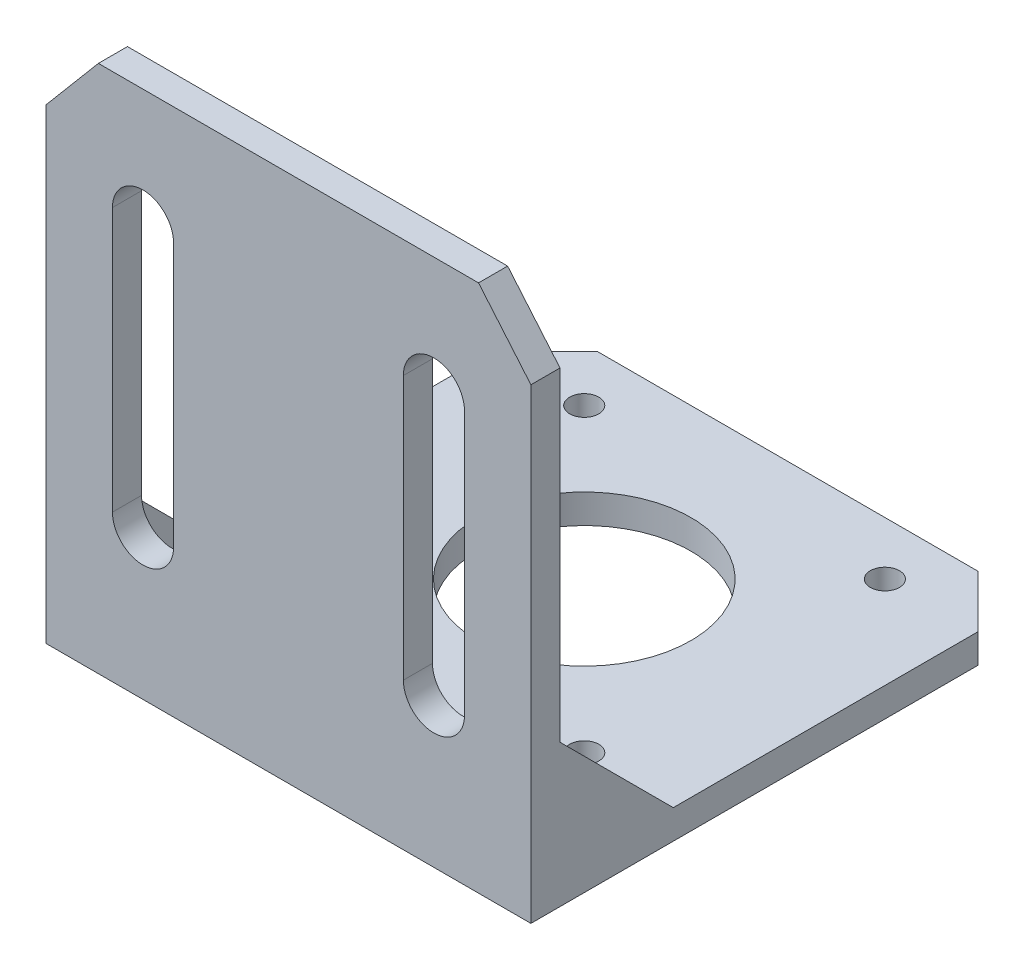
ISO-10303-21;
HEADER;
FILE_DESCRIPTION(('STEP AP214'),'2;1');
FILE_NAME('part.step','',(''),(''),'','','');
FILE_SCHEMA(('AUTOMOTIVE_DESIGN { 1 0 10303 214 1 1 1 1 }'));
ENDSEC;
DATA;
#1=APPLICATION_CONTEXT('core data for automotive mechanical design processes');
#2=APPLICATION_PROTOCOL_DEFINITION('international standard','automotive_design',2000,#1);
#3=PRODUCT_CONTEXT('',#1,'mechanical');
#4=PRODUCT('Part','Part','',(#3));
#5=PRODUCT_RELATED_PRODUCT_CATEGORY('part','',(#4));
#6=PRODUCT_DEFINITION_FORMATION('','',#4);
#7=PRODUCT_DEFINITION_CONTEXT('part definition',#1,'design');
#8=PRODUCT_DEFINITION('design','',#6,#7);
#9=PRODUCT_DEFINITION_SHAPE('','',#8);
#10=(LENGTH_UNIT() NAMED_UNIT(*) SI_UNIT(.MILLI.,.METRE.));
#11=(NAMED_UNIT(*) PLANE_ANGLE_UNIT() SI_UNIT($,.RADIAN.));
#12=(NAMED_UNIT(*) SI_UNIT($,.STERADIAN.) SOLID_ANGLE_UNIT());
#13=UNCERTAINTY_MEASURE_WITH_UNIT(LENGTH_MEASURE(1.E-05),#10,'distance_accuracy_value','');
#14=(GEOMETRIC_REPRESENTATION_CONTEXT(3) GLOBAL_UNCERTAINTY_ASSIGNED_CONTEXT((#13)) GLOBAL_UNIT_ASSIGNED_CONTEXT((#10,
#11,#12)) REPRESENTATION_CONTEXT('',''));
#15=CARTESIAN_POINT('',(0.,0.,0.));
#16=DIRECTION('',(0.,0.,1.));
#17=DIRECTION('',(1.,0.,0.));
#18=AXIS2_PLACEMENT_3D('',#15,#16,#17);
#19=CARTESIAN_POINT('',(0.,3.,0.));
#20=DIRECTION('',(0.,-1.,0.));
#21=DIRECTION('',(0.,0.,-1.));
#22=AXIS2_PLACEMENT_3D('',#19,#20,#21);
#23=PLANE('',#22);
#24=DIRECTION('',(0.,0.,1.));
#25=VECTOR('',#24,1.);
#26=CARTESIAN_POINT('',(22.,3.,0.));
#27=LINE('',#26,#25);
#28=CARTESIAN_POINT('',(22.,3.,8.36981639604411));
#29=VERTEX_POINT('',#28);
#30=CARTESIAN_POINT('',(22.,3.,20.05));
#31=VERTEX_POINT('',#30);
#32=EDGE_CURVE('E61',#29,#31,#27,.T.);
#33=ORIENTED_EDGE('',*,*,#32,.F.);
#34=DIRECTION('',(-1.,0.,0.));
#35=VECTOR('',#34,1.);
#36=CARTESIAN_POINT('',(0.,3.,8.36981639604411));
#37=LINE('',#36,#35);
#38=CARTESIAN_POINT('',(25.,3.,8.36981639604411));
#39=VERTEX_POINT('',#38);
#40=EDGE_CURVE('E205',#29,#39,#37,.F.);
#41=ORIENTED_EDGE('',*,*,#40,.T.);
#42=DIRECTION('',(0.,0.,-1.));
#43=VECTOR('',#42,1.);
#44=CARTESIAN_POINT('',(25.,3.,23.05));
#45=LINE('',#44,#43);
#46=CARTESIAN_POINT('',(25.,3.,-23.05));
#47=VERTEX_POINT('',#46);
#48=EDGE_CURVE('E314',#39,#47,#45,.T.);
#49=ORIENTED_EDGE('',*,*,#48,.T.);
#50=DIRECTION('',(-0.707106781186548,0.,-0.707106781186547));
#51=VECTOR('',#50,1.);
#52=CARTESIAN_POINT('',(19.6,3.,-28.45));
#53=LINE('',#52,#51);
#54=CARTESIAN_POINT('',(19.6,3.,-28.45));
#55=VERTEX_POINT('',#54);
#56=EDGE_CURVE('E318',#47,#55,#53,.T.);
#57=ORIENTED_EDGE('',*,*,#56,.T.);
#58=DIRECTION('',(-1.,0.,0.));
#59=VECTOR('',#58,1.);
#60=CARTESIAN_POINT('',(-19.6,3.,-28.45));
#61=LINE('',#60,#59);
#62=CARTESIAN_POINT('',(-19.6,3.,-28.45));
#63=VERTEX_POINT('',#62);
#64=EDGE_CURVE('E321',#55,#63,#61,.T.);
#65=ORIENTED_EDGE('',*,*,#64,.T.);
#66=DIRECTION('',(-0.707106781186548,0.,0.707106781186547));
#67=VECTOR('',#66,1.);
#68=CARTESIAN_POINT('',(-19.6,3.,-28.45));
#69=LINE('',#68,#67);
#70=CARTESIAN_POINT('',(-25.,3.,-23.05));
#71=VERTEX_POINT('',#70);
#72=EDGE_CURVE('E324',#63,#71,#69,.T.);
#73=ORIENTED_EDGE('',*,*,#72,.T.);
#74=DIRECTION('',(0.,0.,1.));
#75=VECTOR('',#74,1.);
#76=CARTESIAN_POINT('',(-25.,3.,23.05));
#77=LINE('',#76,#75);
#78=CARTESIAN_POINT('',(-25.,3.,8.36981639604411));
#79=VERTEX_POINT('',#78);
#80=EDGE_CURVE('E310',#71,#79,#77,.T.);
#81=ORIENTED_EDGE('',*,*,#80,.T.);
#82=DIRECTION('',(1.,0.,0.));
#83=VECTOR('',#82,1.);
#84=CARTESIAN_POINT('',(0.,3.,8.36981639604411));
#85=LINE('',#84,#83);
#86=CARTESIAN_POINT('',(-22.,3.,8.36981639604411));
#87=VERTEX_POINT('',#86);
#88=EDGE_CURVE('E384',#79,#87,#85,.T.);
#89=ORIENTED_EDGE('',*,*,#88,.T.);
#90=DIRECTION('',(0.,0.,-1.));
#91=VECTOR('',#90,1.);
#92=CARTESIAN_POINT('',(-22.,3.,0.));
#93=LINE('',#92,#91);
#94=CARTESIAN_POINT('',(-22.,3.,20.05));
#95=VERTEX_POINT('',#94);
#96=EDGE_CURVE('E381',#95,#87,#93,.T.);
#97=ORIENTED_EDGE('',*,*,#96,.F.);
#98=DIRECTION('',(1.,0.,0.));
#99=VECTOR('',#98,1.);
#100=CARTESIAN_POINT('',(0.,3.,20.05));
#101=LINE('',#100,#99);
#102=EDGE_CURVE('E258',#95,#31,#101,.T.);
#103=ORIENTED_EDGE('',*,*,#102,.T.);
#104=EDGE_LOOP('',(#33,#41,#49,#57,#65,#73,#81,#89,#97,#103));
#105=FACE_BOUND('',#104,.T.);
#106=CARTESIAN_POINT('',(0.,3.,-7.44999999999999));
#107=DIRECTION('',(0.,1.,0.));
#108=DIRECTION('',(0.,0.,1.));
#109=AXIS2_PLACEMENT_3D('',#106,#107,#108);
#110=CIRCLE('',#109,11.);
#111=CARTESIAN_POINT('',(0.,3.,3.55));
#112=VERTEX_POINT('',#111);
#113=EDGE_CURVE('E302',#112,#112,#110,.T.);
#114=ORIENTED_EDGE('',*,*,#113,.F.);
#115=EDGE_LOOP('',(#114));
#116=FACE_BOUND('',#115,.T.);
#117=CARTESIAN_POINT('',(-15.5,3.,-22.95));
#118=DIRECTION('',(0.,1.,0.));
#119=DIRECTION('',(0.,0.,1.));
#120=AXIS2_PLACEMENT_3D('',#117,#118,#119);
#121=CIRCLE('',#120,1.5);
#122=CARTESIAN_POINT('',(-15.5,3.,-21.45));
#123=VERTEX_POINT('',#122);
#124=EDGE_CURVE('E294',#123,#123,#121,.T.);
#125=ORIENTED_EDGE('',*,*,#124,.F.);
#126=EDGE_LOOP('',(#125));
#127=FACE_BOUND('',#126,.T.);
#128=CARTESIAN_POINT('',(15.5,3.,-22.95));
#129=DIRECTION('',(0.,1.,0.));
#130=DIRECTION('',(0.,0.,-1.));
#131=AXIS2_PLACEMENT_3D('',#128,#129,#130);
#132=CIRCLE('',#131,1.5);
#133=CARTESIAN_POINT('',(15.5,3.,-24.45));
#134=VERTEX_POINT('',#133);
#135=EDGE_CURVE('E286',#134,#134,#132,.T.);
#136=ORIENTED_EDGE('',*,*,#135,.F.);
#137=EDGE_LOOP('',(#136));
#138=FACE_BOUND('',#137,.T.);
#139=CARTESIAN_POINT('',(-15.5,3.,8.05));
#140=DIRECTION('',(0.,1.,0.));
#141=DIRECTION('',(0.,0.,1.));
#142=AXIS2_PLACEMENT_3D('',#139,#140,#141);
#143=CIRCLE('',#142,1.5);
#144=CARTESIAN_POINT('',(-15.5,3.,9.55));
#145=VERTEX_POINT('',#144);
#146=EDGE_CURVE('E278',#145,#145,#143,.T.);
#147=ORIENTED_EDGE('',*,*,#146,.F.);
#148=EDGE_LOOP('',(#147));
#149=FACE_BOUND('',#148,.T.);
#150=CARTESIAN_POINT('',(15.5,3.,8.05));
#151=DIRECTION('',(0.,1.,0.));
#152=DIRECTION('',(0.,0.,-1.));
#153=AXIS2_PLACEMENT_3D('',#150,#151,#152);
#154=CIRCLE('',#153,1.5);
#155=CARTESIAN_POINT('',(15.5,3.,6.55));
#156=VERTEX_POINT('',#155);
#157=EDGE_CURVE('E270',#156,#156,#154,.T.);
#158=ORIENTED_EDGE('',*,*,#157,.F.);
#159=EDGE_LOOP('',(#158));
#160=FACE_BOUND('',#159,.T.);
#161=ADVANCED_FACE('F45',(#105,#116,#127,#138,#149,#160),#23,.F.);
#162=CARTESIAN_POINT('',(0.,0.,0.));
#163=DIRECTION('',(0.,-1.,0.));
#164=DIRECTION('',(0.,0.,-1.));
#165=AXIS2_PLACEMENT_3D('',#162,#163,#164);
#166=PLANE('',#165);
#167=DIRECTION('',(-0.707106781186548,0.,-0.707106781186547));
#168=VECTOR('',#167,1.);
#169=CARTESIAN_POINT('',(19.6,0.,-28.45));
#170=LINE('',#169,#168);
#171=CARTESIAN_POINT('',(25.,0.,-23.05));
#172=VERTEX_POINT('',#171);
#173=CARTESIAN_POINT('',(19.6,0.,-28.45));
#174=VERTEX_POINT('',#173);
#175=EDGE_CURVE('E336',#172,#174,#170,.T.);
#176=ORIENTED_EDGE('',*,*,#175,.F.);
#177=DIRECTION('',(0.,0.,-1.));
#178=VECTOR('',#177,1.);
#179=CARTESIAN_POINT('',(25.,0.,23.05));
#180=LINE('',#179,#178);
#181=CARTESIAN_POINT('',(25.,0.,23.05));
#182=VERTEX_POINT('',#181);
#183=EDGE_CURVE('E333',#182,#172,#180,.T.);
#184=ORIENTED_EDGE('',*,*,#183,.F.);
#185=DIRECTION('',(1.,0.,0.));
#186=VECTOR('',#185,1.);
#187=CARTESIAN_POINT('',(-25.,0.,23.05));
#188=LINE('',#187,#186);
#189=CARTESIAN_POINT('',(-25.,0.,23.05));
#190=VERTEX_POINT('',#189);
#191=EDGE_CURVE('E330',#190,#182,#188,.T.);
#192=ORIENTED_EDGE('',*,*,#191,.F.);
#193=DIRECTION('',(0.,0.,1.));
#194=VECTOR('',#193,1.);
#195=CARTESIAN_POINT('',(-25.,0.,23.05));
#196=LINE('',#195,#194);
#197=CARTESIAN_POINT('',(-25.,0.,-23.05));
#198=VERTEX_POINT('',#197);
#199=EDGE_CURVE('E306',#198,#190,#196,.T.);
#200=ORIENTED_EDGE('',*,*,#199,.F.);
#201=DIRECTION('',(-0.707106781186548,0.,0.707106781186547));
#202=VECTOR('',#201,1.);
#203=CARTESIAN_POINT('',(-19.6,0.,-28.45));
#204=LINE('',#203,#202);
#205=CARTESIAN_POINT('',(-19.6,0.,-28.45));
#206=VERTEX_POINT('',#205);
#207=EDGE_CURVE('E315',#206,#198,#204,.T.);
#208=ORIENTED_EDGE('',*,*,#207,.F.);
#209=DIRECTION('',(-1.,0.,0.));
#210=VECTOR('',#209,1.);
#211=CARTESIAN_POINT('',(-19.6,0.,-28.45));
#212=LINE('',#211,#210);
#213=EDGE_CURVE('E339',#174,#206,#212,.T.);
#214=ORIENTED_EDGE('',*,*,#213,.F.);
#215=EDGE_LOOP('',(#176,#184,#192,#200,#208,#214));
#216=FACE_BOUND('',#215,.T.);
#217=CARTESIAN_POINT('',(-15.5,0.,8.05));
#218=DIRECTION('',(0.,1.,0.));
#219=DIRECTION('',(0.,0.,1.));
#220=AXIS2_PLACEMENT_3D('',#217,#218,#219);
#221=CIRCLE('',#220,1.5);
#222=CARTESIAN_POINT('',(-15.5,0.,9.55));
#223=VERTEX_POINT('',#222);
#224=EDGE_CURVE('E274',#223,#223,#221,.T.);
#225=ORIENTED_EDGE('',*,*,#224,.T.);
#226=EDGE_LOOP('',(#225));
#227=FACE_BOUND('',#226,.T.);
#228=CARTESIAN_POINT('',(-15.5,0.,-22.95));
#229=DIRECTION('',(0.,1.,0.));
#230=DIRECTION('',(0.,0.,1.));
#231=AXIS2_PLACEMENT_3D('',#228,#229,#230);
#232=CIRCLE('',#231,1.5);
#233=CARTESIAN_POINT('',(-15.5,0.,-21.45));
#234=VERTEX_POINT('',#233);
#235=EDGE_CURVE('E290',#234,#234,#232,.T.);
#236=ORIENTED_EDGE('',*,*,#235,.T.);
#237=EDGE_LOOP('',(#236));
#238=FACE_BOUND('',#237,.T.);
#239=CARTESIAN_POINT('',(0.,0.,-7.44999999999999));
#240=DIRECTION('',(0.,1.,0.));
#241=DIRECTION('',(0.,0.,1.));
#242=AXIS2_PLACEMENT_3D('',#239,#240,#241);
#243=CIRCLE('',#242,11.);
#244=CARTESIAN_POINT('',(0.,0.,3.55));
#245=VERTEX_POINT('',#244);
#246=EDGE_CURVE('E298',#245,#245,#243,.T.);
#247=ORIENTED_EDGE('',*,*,#246,.T.);
#248=EDGE_LOOP('',(#247));
#249=FACE_BOUND('',#248,.T.);
#250=CARTESIAN_POINT('',(15.5,0.,-22.95));
#251=DIRECTION('',(0.,1.,0.));
#252=DIRECTION('',(0.,0.,-1.));
#253=AXIS2_PLACEMENT_3D('',#250,#251,#252);
#254=CIRCLE('',#253,1.5);
#255=CARTESIAN_POINT('',(15.5,0.,-24.45));
#256=VERTEX_POINT('',#255);
#257=EDGE_CURVE('E282',#256,#256,#254,.T.);
#258=ORIENTED_EDGE('',*,*,#257,.T.);
#259=EDGE_LOOP('',(#258));
#260=FACE_BOUND('',#259,.T.);
#261=CARTESIAN_POINT('',(15.5,0.,8.05));
#262=DIRECTION('',(0.,1.,0.));
#263=DIRECTION('',(0.,0.,-1.));
#264=AXIS2_PLACEMENT_3D('',#261,#262,#263);
#265=CIRCLE('',#264,1.5);
#266=CARTESIAN_POINT('',(15.5,0.,6.55));
#267=VERTEX_POINT('',#266);
#268=EDGE_CURVE('E269',#267,#267,#265,.T.);
#269=ORIENTED_EDGE('',*,*,#268,.T.);
#270=EDGE_LOOP('',(#269));
#271=FACE_BOUND('',#270,.T.);
#272=ADVANCED_FACE('F509',(#216,#227,#238,#249,#260,#271),#166,.T.);
#273=CARTESIAN_POINT('',(-25.,3.,23.05));
#274=DIRECTION('',(1.,0.,0.));
#275=DIRECTION('',(0.,0.,-1.));
#276=AXIS2_PLACEMENT_3D('',#273,#274,#275);
#277=PLANE('',#276);
#278=ORIENTED_EDGE('',*,*,#199,.T.);
#279=DIRECTION('',(0.,-1.,0.));
#280=VECTOR('',#279,1.);
#281=CARTESIAN_POINT('',(-25.,3.,23.05));
#282=LINE('',#281,#280);
#283=CARTESIAN_POINT('',(-25.,48.1,23.05));
#284=VERTEX_POINT('',#283);
#285=EDGE_CURVE('E363',#284,#190,#282,.T.);
#286=ORIENTED_EDGE('',*,*,#285,.F.);
#287=DIRECTION('',(0.,0.,1.));
#288=VECTOR('',#287,1.);
#289=CARTESIAN_POINT('',(-25.,48.1,20.05));
#290=LINE('',#289,#288);
#291=CARTESIAN_POINT('',(-25.,48.1,20.05));
#292=VERTEX_POINT('',#291);
#293=EDGE_CURVE('E254',#292,#284,#290,.T.);
#294=ORIENTED_EDGE('',*,*,#293,.F.);
#295=DIRECTION('',(0.,-1.,0.));
#296=VECTOR('',#295,1.);
#297=CARTESIAN_POINT('',(-25.,0.,20.05));
#298=LINE('',#297,#296);
#299=CARTESIAN_POINT('',(-25.,14.6801836039558,20.05));
#300=VERTEX_POINT('',#299);
#301=EDGE_CURVE('E241',#292,#300,#298,.T.);
#302=ORIENTED_EDGE('',*,*,#301,.T.);
#303=DIRECTION('',(0.,-0.707106781186544,-0.707106781186551));
#304=VECTOR('',#303,1.);
#305=CARTESIAN_POINT('',(-25.,14.6801836039558,20.05));
#306=LINE('',#305,#304);
#307=EDGE_CURVE('E377',#300,#79,#306,.T.);
#308=ORIENTED_EDGE('',*,*,#307,.T.);
#309=ORIENTED_EDGE('',*,*,#80,.F.);
#310=DIRECTION('',(0.,-1.,0.));
#311=VECTOR('',#310,1.);
#312=CARTESIAN_POINT('',(-25.,3.,-23.05));
#313=LINE('',#312,#311);
#314=EDGE_CURVE('E327',#71,#198,#313,.T.);
#315=ORIENTED_EDGE('',*,*,#314,.T.);
#316=EDGE_LOOP('',(#278,#286,#294,#302,#308,#309,#315));
#317=FACE_BOUND('',#316,.T.);
#318=ADVANCED_FACE('F47',(#317),#277,.F.);
#319=CARTESIAN_POINT('',(-25.,3.,23.05));
#320=DIRECTION('',(0.,0.,-1.));
#321=DIRECTION('',(-1.,0.,0.));
#322=AXIS2_PLACEMENT_3D('',#319,#320,#321);
#323=PLANE('',#322);
#324=ORIENTED_EDGE('',*,*,#191,.T.);
#325=DIRECTION('',(0.,-1.,0.));
#326=VECTOR('',#325,1.);
#327=CARTESIAN_POINT('',(25.,3.,23.05));
#328=LINE('',#327,#326);
#329=CARTESIAN_POINT('',(25.,48.1,23.05));
#330=VERTEX_POINT('',#329);
#331=EDGE_CURVE('E359',#330,#182,#328,.T.);
#332=ORIENTED_EDGE('',*,*,#331,.F.);
#333=DIRECTION('',(-0.644870939209783,0.764291483507891,0.));
#334=VECTOR('',#333,1.);
#335=CARTESIAN_POINT('',(25.,48.1,23.05));
#336=LINE('',#335,#334);
#337=CARTESIAN_POINT('',(19.6,54.5,23.05));
#338=VERTEX_POINT('',#337);
#339=EDGE_CURVE('E246',#330,#338,#336,.T.);
#340=ORIENTED_EDGE('',*,*,#339,.T.);
#341=DIRECTION('',(-1.,0.,0.));
#342=VECTOR('',#341,1.);
#343=CARTESIAN_POINT('',(-19.6,54.5,23.05));
#344=LINE('',#343,#342);
#345=CARTESIAN_POINT('',(-19.6,54.5,23.05));
#346=VERTEX_POINT('',#345);
#347=EDGE_CURVE('E228',#338,#346,#344,.T.);
#348=ORIENTED_EDGE('',*,*,#347,.T.);
#349=DIRECTION('',(-0.644870939209783,-0.764291483507891,0.));
#350=VECTOR('',#349,1.);
#351=CARTESIAN_POINT('',(-25.,48.1,23.05));
#352=LINE('',#351,#350);
#353=EDGE_CURVE('E221',#346,#284,#352,.T.);
#354=ORIENTED_EDGE('',*,*,#353,.T.);
#355=ORIENTED_EDGE('',*,*,#285,.T.);
#356=EDGE_LOOP('',(#324,#332,#340,#348,#354,#355));
#357=FACE_BOUND('',#356,.T.);
#358=DIRECTION('',(0.,-1.,0.));
#359=VECTOR('',#358,1.);
#360=CARTESIAN_POINT('',(11.85,42.35,23.05));
#361=LINE('',#360,#359);
#362=CARTESIAN_POINT('',(11.85,42.35,23.05));
#363=VERTEX_POINT('',#362);
#364=CARTESIAN_POINT('',(11.85,15.15,23.05));
#365=VERTEX_POINT('',#364);
#366=EDGE_CURVE('E414',#363,#365,#361,.T.);
#367=ORIENTED_EDGE('',*,*,#366,.F.);
#368=CARTESIAN_POINT('',(15.,42.35,23.05));
#369=DIRECTION('',(0.,0.,1.));
#370=DIRECTION('',(-1.,0.,0.));
#371=AXIS2_PLACEMENT_3D('',#368,#369,#370);
#372=CIRCLE('',#371,3.14999999999999);
#373=CARTESIAN_POINT('',(18.15,42.35,23.05));
#374=VERTEX_POINT('',#373);
#375=EDGE_CURVE('E389',#374,#363,#372,.T.);
#376=ORIENTED_EDGE('',*,*,#375,.F.);
#377=DIRECTION('',(0.,1.,0.));
#378=VECTOR('',#377,1.);
#379=CARTESIAN_POINT('',(18.15,42.35,23.05));
#380=LINE('',#379,#378);
#381=CARTESIAN_POINT('',(18.15,15.15,23.05));
#382=VERTEX_POINT('',#381);
#383=EDGE_CURVE('E399',#382,#374,#380,.T.);
#384=ORIENTED_EDGE('',*,*,#383,.F.);
#385=CARTESIAN_POINT('',(15.,15.15,23.05));
#386=DIRECTION('',(0.,0.,1.));
#387=DIRECTION('',(-1.,0.,0.));
#388=AXIS2_PLACEMENT_3D('',#385,#386,#387);
#389=CIRCLE('',#388,3.15000000000001);
#390=EDGE_CURVE('E418',#365,#382,#389,.T.);
#391=ORIENTED_EDGE('',*,*,#390,.F.);
#392=EDGE_LOOP('',(#367,#376,#384,#391));
#393=FACE_BOUND('',#392,.T.);
#394=DIRECTION('',(0.,-1.,0.));
#395=VECTOR('',#394,1.);
#396=CARTESIAN_POINT('',(-18.15,42.35,23.05));
#397=LINE('',#396,#395);
#398=CARTESIAN_POINT('',(-18.15,42.35,23.05));
#399=VERTEX_POINT('',#398);
#400=CARTESIAN_POINT('',(-18.15,15.15,23.05));
#401=VERTEX_POINT('',#400);
#402=EDGE_CURVE('E457',#399,#401,#397,.T.);
#403=ORIENTED_EDGE('',*,*,#402,.F.);
#404=CARTESIAN_POINT('',(-15.,42.35,23.05));
#405=DIRECTION('',(0.,0.,1.));
#406=DIRECTION('',(1.,0.,0.));
#407=AXIS2_PLACEMENT_3D('',#404,#405,#406);
#408=CIRCLE('',#407,3.14999999999999);
#409=CARTESIAN_POINT('',(-11.85,42.35,23.05));
#410=VERTEX_POINT('',#409);
#411=EDGE_CURVE('E428',#410,#399,#408,.T.);
#412=ORIENTED_EDGE('',*,*,#411,.F.);
#413=DIRECTION('',(0.,1.,0.));
#414=VECTOR('',#413,1.);
#415=CARTESIAN_POINT('',(-11.85,42.35,23.05));
#416=LINE('',#415,#414);
#417=CARTESIAN_POINT('',(-11.85,15.15,23.05));
#418=VERTEX_POINT('',#417);
#419=EDGE_CURVE('E443',#418,#410,#416,.T.);
#420=ORIENTED_EDGE('',*,*,#419,.F.);
#421=CARTESIAN_POINT('',(-15.,15.15,23.05));
#422=DIRECTION('',(0.,0.,1.));
#423=DIRECTION('',(1.,0.,0.));
#424=AXIS2_PLACEMENT_3D('',#421,#422,#423);
#425=CIRCLE('',#424,3.15000000000001);
#426=EDGE_CURVE('E461',#401,#418,#425,.T.);
#427=ORIENTED_EDGE('',*,*,#426,.F.);
#428=EDGE_LOOP('',(#403,#412,#420,#427));
#429=FACE_BOUND('',#428,.T.);
#430=ADVANCED_FACE('F487',(#357,#393,#429),#323,.F.);
#431=CARTESIAN_POINT('',(25.,3.,23.05));
#432=DIRECTION('',(-1.,0.,0.));
#433=DIRECTION('',(0.,0.,1.));
#434=AXIS2_PLACEMENT_3D('',#431,#432,#433);
#435=PLANE('',#434);
#436=ORIENTED_EDGE('',*,*,#48,.F.);
#437=DIRECTION('',(0.,-0.707106781186544,-0.707106781186551));
#438=VECTOR('',#437,1.);
#439=CARTESIAN_POINT('',(25.,14.6801836039558,20.05));
#440=LINE('',#439,#438);
#441=CARTESIAN_POINT('',(25.,14.6801836039558,20.05));
#442=VERTEX_POINT('',#441);
#443=EDGE_CURVE('E207',#442,#39,#440,.T.);
#444=ORIENTED_EDGE('',*,*,#443,.F.);
#445=DIRECTION('',(0.,1.,0.));
#446=VECTOR('',#445,1.);
#447=CARTESIAN_POINT('',(25.,48.1,20.05));
#448=LINE('',#447,#446);
#449=CARTESIAN_POINT('',(25.,48.1,20.05));
#450=VERTEX_POINT('',#449);
#451=EDGE_CURVE('E213',#442,#450,#448,.T.);
#452=ORIENTED_EDGE('',*,*,#451,.T.);
#453=DIRECTION('',(0.,0.,1.));
#454=VECTOR('',#453,1.);
#455=CARTESIAN_POINT('',(25.,48.1,20.05));
#456=LINE('',#455,#454);
#457=EDGE_CURVE('E245',#450,#330,#456,.T.);
#458=ORIENTED_EDGE('',*,*,#457,.T.);
#459=ORIENTED_EDGE('',*,*,#331,.T.);
#460=ORIENTED_EDGE('',*,*,#183,.T.);
#461=DIRECTION('',(0.,-1.,0.));
#462=VECTOR('',#461,1.);
#463=CARTESIAN_POINT('',(25.,3.,-23.05));
#464=LINE('',#463,#462);
#465=EDGE_CURVE('E355',#47,#172,#464,.T.);
#466=ORIENTED_EDGE('',*,*,#465,.F.);
#467=EDGE_LOOP('',(#436,#444,#452,#458,#459,#460,#466));
#468=FACE_BOUND('',#467,.T.);
#469=ADVANCED_FACE('F531',(#468),#435,.F.);
#470=CARTESIAN_POINT('',(19.6,3.,-28.45));
#471=DIRECTION('',(-0.707106781186547,0.,0.707106781186548));
#472=DIRECTION('',(0.707106781186548,0.,0.707106781186547));
#473=AXIS2_PLACEMENT_3D('',#470,#471,#472);
#474=PLANE('',#473);
#475=ORIENTED_EDGE('',*,*,#175,.T.);
#476=DIRECTION('',(0.,-1.,0.));
#477=VECTOR('',#476,1.);
#478=CARTESIAN_POINT('',(19.6,3.,-28.45));
#479=LINE('',#478,#477);
#480=EDGE_CURVE('E351',#55,#174,#479,.T.);
#481=ORIENTED_EDGE('',*,*,#480,.F.);
#482=ORIENTED_EDGE('',*,*,#56,.F.);
#483=ORIENTED_EDGE('',*,*,#465,.T.);
#484=EDGE_LOOP('',(#475,#481,#482,#483));
#485=FACE_BOUND('',#484,.T.);
#486=ADVANCED_FACE('F527',(#485),#474,.F.);
#487=CARTESIAN_POINT('',(-19.6,3.,-28.45));
#488=DIRECTION('',(0.,0.,1.));
#489=DIRECTION('',(1.,0.,0.));
#490=AXIS2_PLACEMENT_3D('',#487,#488,#489);
#491=PLANE('',#490);
#492=ORIENTED_EDGE('',*,*,#213,.T.);
#493=DIRECTION('',(0.,-1.,0.));
#494=VECTOR('',#493,1.);
#495=CARTESIAN_POINT('',(-19.6,3.,-28.45));
#496=LINE('',#495,#494);
#497=EDGE_CURVE('E347',#63,#206,#496,.T.);
#498=ORIENTED_EDGE('',*,*,#497,.F.);
#499=ORIENTED_EDGE('',*,*,#64,.F.);
#500=ORIENTED_EDGE('',*,*,#480,.T.);
#501=EDGE_LOOP('',(#492,#498,#499,#500));
#502=FACE_BOUND('',#501,.T.);
#503=ADVANCED_FACE('F523',(#502),#491,.F.);
#504=CARTESIAN_POINT('',(-19.6,3.,-28.45));
#505=DIRECTION('',(0.707106781186547,0.,0.707106781186548));
#506=DIRECTION('',(0.707106781186548,0.,-0.707106781186547));
#507=AXIS2_PLACEMENT_3D('',#504,#505,#506);
#508=PLANE('',#507);
#509=ORIENTED_EDGE('',*,*,#207,.T.);
#510=ORIENTED_EDGE('',*,*,#314,.F.);
#511=ORIENTED_EDGE('',*,*,#72,.F.);
#512=ORIENTED_EDGE('',*,*,#497,.T.);
#513=EDGE_LOOP('',(#509,#510,#511,#512));
#514=FACE_BOUND('',#513,.T.);
#515=ADVANCED_FACE('F520',(#514),#508,.F.);
#516=CARTESIAN_POINT('',(0.,3.,-7.44999999999999));
#517=DIRECTION('',(0.,-1.,0.));
#518=DIRECTION('',(0.,0.,-1.));
#519=AXIS2_PLACEMENT_3D('',#516,#517,#518);
#520=CYLINDRICAL_SURFACE('',#519,11.);
#521=ORIENTED_EDGE('',*,*,#113,.T.);
#522=EDGE_LOOP('',(#521));
#523=FACE_BOUND('',#522,.T.);
#524=ORIENTED_EDGE('',*,*,#246,.F.);
#525=EDGE_LOOP('',(#524));
#526=FACE_BOUND('',#525,.T.);
#527=ADVANCED_FACE('F517',(#523,#526),#520,.F.);
#528=CARTESIAN_POINT('',(-15.5,3.,-22.95));
#529=DIRECTION('',(0.,-1.,0.));
#530=DIRECTION('',(0.,0.,-1.));
#531=AXIS2_PLACEMENT_3D('',#528,#529,#530);
#532=CYLINDRICAL_SURFACE('',#531,1.5);
#533=ORIENTED_EDGE('',*,*,#124,.T.);
#534=EDGE_LOOP('',(#533));
#535=FACE_BOUND('',#534,.T.);
#536=ORIENTED_EDGE('',*,*,#235,.F.);
#537=EDGE_LOOP('',(#536));
#538=FACE_BOUND('',#537,.T.);
#539=ADVANCED_FACE('F579',(#535,#538),#532,.F.);
#540=CARTESIAN_POINT('',(15.5,3.,-22.95));
#541=DIRECTION('',(0.,-1.,0.));
#542=DIRECTION('',(0.,0.,-1.));
#543=AXIS2_PLACEMENT_3D('',#540,#541,#542);
#544=CYLINDRICAL_SURFACE('',#543,1.5);
#545=ORIENTED_EDGE('',*,*,#135,.T.);
#546=EDGE_LOOP('',(#545));
#547=FACE_BOUND('',#546,.T.);
#548=ORIENTED_EDGE('',*,*,#257,.F.);
#549=EDGE_LOOP('',(#548));
#550=FACE_BOUND('',#549,.T.);
#551=ADVANCED_FACE('F576',(#547,#550),#544,.F.);
#552=CARTESIAN_POINT('',(-15.5,3.,8.05));
#553=DIRECTION('',(0.,-1.,0.));
#554=DIRECTION('',(0.,0.,-1.));
#555=AXIS2_PLACEMENT_3D('',#552,#553,#554);
#556=CYLINDRICAL_SURFACE('',#555,1.5);
#557=ORIENTED_EDGE('',*,*,#146,.T.);
#558=EDGE_LOOP('',(#557));
#559=FACE_BOUND('',#558,.T.);
#560=ORIENTED_EDGE('',*,*,#224,.F.);
#561=EDGE_LOOP('',(#560));
#562=FACE_BOUND('',#561,.T.);
#563=ADVANCED_FACE('F567',(#559,#562),#556,.F.);
#564=CARTESIAN_POINT('',(15.5,3.,8.05));
#565=DIRECTION('',(0.,-1.,0.));
#566=DIRECTION('',(0.,0.,-1.));
#567=AXIS2_PLACEMENT_3D('',#564,#565,#566);
#568=CYLINDRICAL_SURFACE('',#567,1.5);
#569=ORIENTED_EDGE('',*,*,#157,.T.);
#570=EDGE_LOOP('',(#569));
#571=FACE_BOUND('',#570,.T.);
#572=ORIENTED_EDGE('',*,*,#268,.F.);
#573=EDGE_LOOP('',(#572));
#574=FACE_BOUND('',#573,.T.);
#575=ADVANCED_FACE('F560',(#571,#574),#568,.F.);
#576=CARTESIAN_POINT('',(0.,0.,20.05));
#577=DIRECTION('',(0.,0.,-1.));
#578=DIRECTION('',(-1.,0.,0.));
#579=AXIS2_PLACEMENT_3D('',#576,#577,#578);
#580=PLANE('',#579);
#581=DIRECTION('',(-1.,0.,0.));
#582=VECTOR('',#581,1.);
#583=CARTESIAN_POINT('',(0.,14.6801836039558,20.05));
#584=LINE('',#583,#582);
#585=CARTESIAN_POINT('',(22.,14.6801836039558,20.05));
#586=VERTEX_POINT('',#585);
#587=EDGE_CURVE('E11',#586,#442,#584,.F.);
#588=ORIENTED_EDGE('',*,*,#587,.F.);
#589=DIRECTION('',(0.,-1.,0.));
#590=VECTOR('',#589,1.);
#591=CARTESIAN_POINT('',(22.,0.,20.05));
#592=LINE('',#591,#590);
#593=EDGE_CURVE('E54',#586,#31,#592,.T.);
#594=ORIENTED_EDGE('',*,*,#593,.T.);
#595=ORIENTED_EDGE('',*,*,#102,.F.);
#596=DIRECTION('',(0.,1.,0.));
#597=VECTOR('',#596,1.);
#598=CARTESIAN_POINT('',(-22.,0.,20.05));
#599=LINE('',#598,#597);
#600=CARTESIAN_POINT('',(-22.,14.6801836039558,20.05));
#601=VERTEX_POINT('',#600);
#602=EDGE_CURVE('E367',#95,#601,#599,.T.);
#603=ORIENTED_EDGE('',*,*,#602,.T.);
#604=DIRECTION('',(1.,0.,0.));
#605=VECTOR('',#604,1.);
#606=CARTESIAN_POINT('',(0.,14.6801836039558,20.05));
#607=LINE('',#606,#605);
#608=EDGE_CURVE('E200',#300,#601,#607,.T.);
#609=ORIENTED_EDGE('',*,*,#608,.F.);
#610=ORIENTED_EDGE('',*,*,#301,.F.);
#611=DIRECTION('',(-0.644870939209783,-0.764291483507891,0.));
#612=VECTOR('',#611,1.);
#613=CARTESIAN_POINT('',(-25.,48.1,20.05));
#614=LINE('',#613,#612);
#615=CARTESIAN_POINT('',(-19.6,54.5,20.05));
#616=VERTEX_POINT('',#615);
#617=EDGE_CURVE('E237',#616,#292,#614,.T.);
#618=ORIENTED_EDGE('',*,*,#617,.F.);
#619=DIRECTION('',(-1.,0.,0.));
#620=VECTOR('',#619,1.);
#621=CARTESIAN_POINT('',(-19.6,54.5,20.05));
#622=LINE('',#621,#620);
#623=CARTESIAN_POINT('',(19.6,54.5,20.05));
#624=VERTEX_POINT('',#623);
#625=EDGE_CURVE('E225',#624,#616,#622,.T.);
#626=ORIENTED_EDGE('',*,*,#625,.F.);
#627=DIRECTION('',(-0.644870939209783,0.764291483507891,0.));
#628=VECTOR('',#627,1.);
#629=CARTESIAN_POINT('',(25.,48.1,20.05));
#630=LINE('',#629,#628);
#631=EDGE_CURVE('E216',#450,#624,#630,.T.);
#632=ORIENTED_EDGE('',*,*,#631,.F.);
#633=ORIENTED_EDGE('',*,*,#451,.F.);
#634=EDGE_LOOP('',(#588,#594,#595,#603,#609,#610,#618,#626,#632,#633));
#635=FACE_BOUND('',#634,.T.);
#636=CARTESIAN_POINT('',(-15.,42.35,20.05));
#637=DIRECTION('',(0.,0.,1.));
#638=DIRECTION('',(1.,0.,0.));
#639=AXIS2_PLACEMENT_3D('',#636,#637,#638);
#640=CIRCLE('',#639,3.14999999999999);
#641=CARTESIAN_POINT('',(-11.85,42.35,20.05));
#642=VERTEX_POINT('',#641);
#643=CARTESIAN_POINT('',(-18.15,42.35,20.05));
#644=VERTEX_POINT('',#643);
#645=EDGE_CURVE('E438',#642,#644,#640,.T.);
#646=ORIENTED_EDGE('',*,*,#645,.T.);
#647=DIRECTION('',(0.,-1.,0.));
#648=VECTOR('',#647,1.);
#649=CARTESIAN_POINT('',(-18.15,42.35,20.05));
#650=LINE('',#649,#648);
#651=CARTESIAN_POINT('',(-18.15,15.15,20.05));
#652=VERTEX_POINT('',#651);
#653=EDGE_CURVE('E442',#644,#652,#650,.T.);
#654=ORIENTED_EDGE('',*,*,#653,.T.);
#655=CARTESIAN_POINT('',(-15.,15.15,20.05));
#656=DIRECTION('',(0.,0.,1.));
#657=DIRECTION('',(1.,0.,0.));
#658=AXIS2_PLACEMENT_3D('',#655,#656,#657);
#659=CIRCLE('',#658,3.15000000000001);
#660=CARTESIAN_POINT('',(-11.85,15.15,20.05));
#661=VERTEX_POINT('',#660);
#662=EDGE_CURVE('E447',#652,#661,#659,.T.);
#663=ORIENTED_EDGE('',*,*,#662,.T.);
#664=DIRECTION('',(0.,1.,0.));
#665=VECTOR('',#664,1.);
#666=CARTESIAN_POINT('',(-11.85,42.35,20.05));
#667=LINE('',#666,#665);
#668=EDGE_CURVE('E451',#661,#642,#667,.T.);
#669=ORIENTED_EDGE('',*,*,#668,.T.);
#670=EDGE_LOOP('',(#646,#654,#663,#669));
#671=FACE_BOUND('',#670,.T.);
#672=CARTESIAN_POINT('',(15.,42.35,20.05));
#673=DIRECTION('',(0.,0.,1.));
#674=DIRECTION('',(-1.,0.,0.));
#675=AXIS2_PLACEMENT_3D('',#672,#673,#674);
#676=CIRCLE('',#675,3.14999999999999);
#677=CARTESIAN_POINT('',(18.15,42.35,20.05));
#678=VERTEX_POINT('',#677);
#679=CARTESIAN_POINT('',(11.85,42.35,20.05));
#680=VERTEX_POINT('',#679);
#681=EDGE_CURVE('E394',#678,#680,#676,.T.);
#682=ORIENTED_EDGE('',*,*,#681,.T.);
#683=DIRECTION('',(0.,-1.,0.));
#684=VECTOR('',#683,1.);
#685=CARTESIAN_POINT('',(11.85,42.35,20.05));
#686=LINE('',#685,#684);
#687=CARTESIAN_POINT('',(11.85,15.15,20.05));
#688=VERTEX_POINT('',#687);
#689=EDGE_CURVE('E398',#680,#688,#686,.T.);
#690=ORIENTED_EDGE('',*,*,#689,.T.);
#691=CARTESIAN_POINT('',(15.,15.15,20.05));
#692=DIRECTION('',(0.,0.,1.));
#693=DIRECTION('',(-1.,0.,0.));
#694=AXIS2_PLACEMENT_3D('',#691,#692,#693);
#695=CIRCLE('',#694,3.15000000000001);
#696=CARTESIAN_POINT('',(18.15,15.15,20.05));
#697=VERTEX_POINT('',#696);
#698=EDGE_CURVE('E403',#688,#697,#695,.T.);
#699=ORIENTED_EDGE('',*,*,#698,.T.);
#700=DIRECTION('',(0.,1.,0.));
#701=VECTOR('',#700,1.);
#702=CARTESIAN_POINT('',(18.15,42.35,20.05));
#703=LINE('',#702,#701);
#704=EDGE_CURVE('E407',#697,#678,#703,.T.);
#705=ORIENTED_EDGE('',*,*,#704,.T.);
#706=EDGE_LOOP('',(#682,#690,#699,#705));
#707=FACE_BOUND('',#706,.T.);
#708=ADVANCED_FACE('F210',(#635,#671,#707),#580,.T.);
#709=CARTESIAN_POINT('',(-25.,48.1,20.05));
#710=DIRECTION('',(-0.764291483507891,0.644870939209783,0.));
#711=DIRECTION('',(-0.644870939209783,-0.764291483507891,0.));
#712=AXIS2_PLACEMENT_3D('',#709,#710,#711);
#713=PLANE('',#712);
#714=ORIENTED_EDGE('',*,*,#353,.F.);
#715=DIRECTION('',(0.,0.,1.));
#716=VECTOR('',#715,1.);
#717=CARTESIAN_POINT('',(-19.6,54.5,20.05));
#718=LINE('',#717,#716);
#719=EDGE_CURVE('E259',#616,#346,#718,.T.);
#720=ORIENTED_EDGE('',*,*,#719,.F.);
#721=ORIENTED_EDGE('',*,*,#617,.T.);
#722=ORIENTED_EDGE('',*,*,#293,.T.);
#723=EDGE_LOOP('',(#714,#720,#721,#722));
#724=FACE_BOUND('',#723,.T.);
#725=ADVANCED_FACE('F559',(#724),#713,.T.);
#726=CARTESIAN_POINT('',(-19.6,54.5,20.05));
#727=DIRECTION('',(0.,1.,0.));
#728=DIRECTION('',(-1.,0.,0.));
#729=AXIS2_PLACEMENT_3D('',#726,#727,#728);
#730=PLANE('',#729);
#731=ORIENTED_EDGE('',*,*,#347,.F.);
#732=DIRECTION('',(0.,0.,1.));
#733=VECTOR('',#732,1.);
#734=CARTESIAN_POINT('',(19.6,54.5,20.05));
#735=LINE('',#734,#733);
#736=EDGE_CURVE('E262',#624,#338,#735,.T.);
#737=ORIENTED_EDGE('',*,*,#736,.F.);
#738=ORIENTED_EDGE('',*,*,#625,.T.);
#739=ORIENTED_EDGE('',*,*,#719,.T.);
#740=EDGE_LOOP('',(#731,#737,#738,#739));
#741=FACE_BOUND('',#740,.T.);
#742=ADVANCED_FACE('F503',(#741),#730,.T.);
#743=CARTESIAN_POINT('',(25.,48.1,20.05));
#744=DIRECTION('',(0.764291483507891,0.644870939209783,0.));
#745=DIRECTION('',(-0.644870939209783,0.764291483507891,0.));
#746=AXIS2_PLACEMENT_3D('',#743,#744,#745);
#747=PLANE('',#746);
#748=ORIENTED_EDGE('',*,*,#339,.F.);
#749=ORIENTED_EDGE('',*,*,#457,.F.);
#750=ORIENTED_EDGE('',*,*,#631,.T.);
#751=ORIENTED_EDGE('',*,*,#736,.T.);
#752=EDGE_LOOP('',(#748,#749,#750,#751));
#753=FACE_BOUND('',#752,.T.);
#754=ADVANCED_FACE('F496',(#753),#747,.T.);
#755=CARTESIAN_POINT('',(-15.,42.35,20.05));
#756=DIRECTION('',(0.,0.,1.));
#757=DIRECTION('',(1.,0.,0.));
#758=AXIS2_PLACEMENT_3D('',#755,#756,#757);
#759=CYLINDRICAL_SURFACE('',#758,3.14999999999999);
#760=ORIENTED_EDGE('',*,*,#411,.T.);
#761=DIRECTION('',(0.,0.,1.));
#762=VECTOR('',#761,1.);
#763=CARTESIAN_POINT('',(-18.15,42.35,20.05));
#764=LINE('',#763,#762);
#765=EDGE_CURVE('E231',#644,#399,#764,.T.);
#766=ORIENTED_EDGE('',*,*,#765,.F.);
#767=ORIENTED_EDGE('',*,*,#645,.F.);
#768=DIRECTION('',(0.,0.,1.));
#769=VECTOR('',#768,1.);
#770=CARTESIAN_POINT('',(-11.85,42.35,20.05));
#771=LINE('',#770,#769);
#772=EDGE_CURVE('E250',#642,#410,#771,.T.);
#773=ORIENTED_EDGE('',*,*,#772,.T.);
#774=EDGE_LOOP('',(#760,#766,#767,#773));
#775=FACE_BOUND('',#774,.T.);
#776=ADVANCED_FACE('F494',(#775),#759,.F.);
#777=CARTESIAN_POINT('',(-11.85,42.35,20.05));
#778=DIRECTION('',(1.,0.,0.));
#779=DIRECTION('',(0.,1.,0.));
#780=AXIS2_PLACEMENT_3D('',#777,#778,#779);
#781=PLANE('',#780);
#782=ORIENTED_EDGE('',*,*,#419,.T.);
#783=ORIENTED_EDGE('',*,*,#772,.F.);
#784=ORIENTED_EDGE('',*,*,#668,.F.);
#785=DIRECTION('',(0.,0.,1.));
#786=VECTOR('',#785,1.);
#787=CARTESIAN_POINT('',(-11.85,15.15,20.05));
#788=LINE('',#787,#786);
#789=EDGE_CURVE('E470',#661,#418,#788,.T.);
#790=ORIENTED_EDGE('',*,*,#789,.T.);
#791=EDGE_LOOP('',(#782,#783,#784,#790));
#792=FACE_BOUND('',#791,.T.);
#793=ADVANCED_FACE('F492',(#792),#781,.F.);
#794=CARTESIAN_POINT('',(-15.,15.15,20.05));
#795=DIRECTION('',(0.,0.,1.));
#796=DIRECTION('',(1.,0.,0.));
#797=AXIS2_PLACEMENT_3D('',#794,#795,#796);
#798=CYLINDRICAL_SURFACE('',#797,3.15000000000001);
#799=ORIENTED_EDGE('',*,*,#426,.T.);
#800=ORIENTED_EDGE('',*,*,#789,.F.);
#801=ORIENTED_EDGE('',*,*,#662,.F.);
#802=DIRECTION('',(0.,0.,1.));
#803=VECTOR('',#802,1.);
#804=CARTESIAN_POINT('',(-18.15,15.15,20.05));
#805=LINE('',#804,#803);
#806=EDGE_CURVE('E472',#652,#401,#805,.T.);
#807=ORIENTED_EDGE('',*,*,#806,.T.);
#808=EDGE_LOOP('',(#799,#800,#801,#807));
#809=FACE_BOUND('',#808,.T.);
#810=ADVANCED_FACE('F489',(#809),#798,.F.);
#811=CARTESIAN_POINT('',(-18.15,42.35,20.05));
#812=DIRECTION('',(-1.,0.,0.));
#813=DIRECTION('',(0.,-1.,0.));
#814=AXIS2_PLACEMENT_3D('',#811,#812,#813);
#815=PLANE('',#814);
#816=ORIENTED_EDGE('',*,*,#402,.T.);
#817=ORIENTED_EDGE('',*,*,#806,.F.);
#818=ORIENTED_EDGE('',*,*,#653,.F.);
#819=ORIENTED_EDGE('',*,*,#765,.T.);
#820=EDGE_LOOP('',(#816,#817,#818,#819));
#821=FACE_BOUND('',#820,.T.);
#822=ADVANCED_FACE('F481',(#821),#815,.F.);
#823=CARTESIAN_POINT('',(15.,42.35,20.05));
#824=DIRECTION('',(0.,0.,1.));
#825=DIRECTION('',(1.,0.,0.));
#826=AXIS2_PLACEMENT_3D('',#823,#824,#825);
#827=CYLINDRICAL_SURFACE('',#826,3.14999999999999);
#828=ORIENTED_EDGE('',*,*,#375,.T.);
#829=DIRECTION('',(0.,0.,1.));
#830=VECTOR('',#829,1.);
#831=CARTESIAN_POINT('',(11.85,42.35,20.05));
#832=LINE('',#831,#830);
#833=EDGE_CURVE('E411',#680,#363,#832,.T.);
#834=ORIENTED_EDGE('',*,*,#833,.F.);
#835=ORIENTED_EDGE('',*,*,#681,.F.);
#836=DIRECTION('',(0.,0.,1.));
#837=VECTOR('',#836,1.);
#838=CARTESIAN_POINT('',(18.15,42.35,20.05));
#839=LINE('',#838,#837);
#840=EDGE_CURVE('E425',#678,#374,#839,.T.);
#841=ORIENTED_EDGE('',*,*,#840,.T.);
#842=EDGE_LOOP('',(#828,#834,#835,#841));
#843=FACE_BOUND('',#842,.T.);
#844=ADVANCED_FACE('F552',(#843),#827,.F.);
#845=CARTESIAN_POINT('',(18.15,42.35,20.05));
#846=DIRECTION('',(1.,0.,0.));
#847=DIRECTION('',(0.,1.,0.));
#848=AXIS2_PLACEMENT_3D('',#845,#846,#847);
#849=PLANE('',#848);
#850=ORIENTED_EDGE('',*,*,#383,.T.);
#851=ORIENTED_EDGE('',*,*,#840,.F.);
#852=ORIENTED_EDGE('',*,*,#704,.F.);
#853=DIRECTION('',(0.,0.,1.));
#854=VECTOR('',#853,1.);
#855=CARTESIAN_POINT('',(18.15,15.15,20.05));
#856=LINE('',#855,#854);
#857=EDGE_CURVE('E429',#697,#382,#856,.T.);
#858=ORIENTED_EDGE('',*,*,#857,.T.);
#859=EDGE_LOOP('',(#850,#851,#852,#858));
#860=FACE_BOUND('',#859,.T.);
#861=ADVANCED_FACE('F555',(#860),#849,.F.);
#862=CARTESIAN_POINT('',(15.,15.15,20.05));
#863=DIRECTION('',(0.,0.,1.));
#864=DIRECTION('',(1.,0.,0.));
#865=AXIS2_PLACEMENT_3D('',#862,#863,#864);
#866=CYLINDRICAL_SURFACE('',#865,3.15000000000001);
#867=ORIENTED_EDGE('',*,*,#390,.T.);
#868=ORIENTED_EDGE('',*,*,#857,.F.);
#869=ORIENTED_EDGE('',*,*,#698,.F.);
#870=DIRECTION('',(0.,0.,1.));
#871=VECTOR('',#870,1.);
#872=CARTESIAN_POINT('',(11.85,15.15,20.05));
#873=LINE('',#872,#871);
#874=EDGE_CURVE('E432',#688,#365,#873,.T.);
#875=ORIENTED_EDGE('',*,*,#874,.T.);
#876=EDGE_LOOP('',(#867,#868,#869,#875));
#877=FACE_BOUND('',#876,.T.);
#878=ADVANCED_FACE('F557',(#877),#866,.F.);
#879=CARTESIAN_POINT('',(11.85,42.35,20.05));
#880=DIRECTION('',(-1.,0.,0.));
#881=DIRECTION('',(0.,-1.,0.));
#882=AXIS2_PLACEMENT_3D('',#879,#880,#881);
#883=PLANE('',#882);
#884=ORIENTED_EDGE('',*,*,#366,.T.);
#885=ORIENTED_EDGE('',*,*,#874,.F.);
#886=ORIENTED_EDGE('',*,*,#689,.F.);
#887=ORIENTED_EDGE('',*,*,#833,.T.);
#888=EDGE_LOOP('',(#884,#885,#886,#887));
#889=FACE_BOUND('',#888,.T.);
#890=ADVANCED_FACE('F548',(#889),#883,.F.);
#891=CARTESIAN_POINT('',(-25.,14.6801836039558,20.05));
#892=DIRECTION('',(0.,0.707106781186551,-0.707106781186544));
#893=DIRECTION('',(0.,-0.707106781186544,-0.707106781186551));
#894=AXIS2_PLACEMENT_3D('',#891,#892,#893);
#895=PLANE('',#894);
#896=ORIENTED_EDGE('',*,*,#88,.F.);
#897=ORIENTED_EDGE('',*,*,#307,.F.);
#898=ORIENTED_EDGE('',*,*,#608,.T.);
#899=DIRECTION('',(0.,-0.707106781186544,-0.707106781186551));
#900=VECTOR('',#899,1.);
#901=CARTESIAN_POINT('',(-22.,14.6801836039558,20.05));
#902=LINE('',#901,#900);
#903=EDGE_CURVE('E69',#601,#87,#902,.T.);
#904=ORIENTED_EDGE('',*,*,#903,.T.);
#905=EDGE_LOOP('',(#896,#897,#898,#904));
#906=FACE_BOUND('',#905,.T.);
#907=ADVANCED_FACE('F374',(#906),#895,.T.);
#908=CARTESIAN_POINT('',(-22.,27.25,-2.7));
#909=DIRECTION('',(-1.,0.,0.));
#910=DIRECTION('',(0.,0.,1.));
#911=AXIS2_PLACEMENT_3D('',#908,#909,#910);
#912=PLANE('',#911);
#913=ORIENTED_EDGE('',*,*,#602,.F.);
#914=ORIENTED_EDGE('',*,*,#96,.T.);
#915=ORIENTED_EDGE('',*,*,#903,.F.);
#916=EDGE_LOOP('',(#913,#914,#915));
#917=FACE_BOUND('',#916,.T.);
#918=ADVANCED_FACE('F380',(#917),#912,.F.);
#919=CARTESIAN_POINT('',(25.,14.6801836039558,20.05));
#920=DIRECTION('',(0.,-0.707106781186551,0.707106781186544));
#921=DIRECTION('',(0.,-0.707106781186544,-0.707106781186551));
#922=AXIS2_PLACEMENT_3D('',#919,#920,#921);
#923=PLANE('',#922);
#924=ORIENTED_EDGE('',*,*,#40,.F.);
#925=DIRECTION('',(0.,-0.707106781186544,-0.707106781186551));
#926=VECTOR('',#925,1.);
#927=CARTESIAN_POINT('',(22.,14.6801836039558,20.05));
#928=LINE('',#927,#926);
#929=EDGE_CURVE('E194',#586,#29,#928,.T.);
#930=ORIENTED_EDGE('',*,*,#929,.F.);
#931=ORIENTED_EDGE('',*,*,#587,.T.);
#932=ORIENTED_EDGE('',*,*,#443,.T.);
#933=EDGE_LOOP('',(#924,#930,#931,#932));
#934=FACE_BOUND('',#933,.T.);
#935=ADVANCED_FACE('F202',(#934),#923,.F.);
#936=CARTESIAN_POINT('',(22.,27.25,-2.7));
#937=DIRECTION('',(1.,0.,0.));
#938=DIRECTION('',(0.,0.,-1.));
#939=AXIS2_PLACEMENT_3D('',#936,#937,#938);
#940=PLANE('',#939);
#941=ORIENTED_EDGE('',*,*,#929,.T.);
#942=ORIENTED_EDGE('',*,*,#32,.T.);
#943=ORIENTED_EDGE('',*,*,#593,.F.);
#944=EDGE_LOOP('',(#941,#942,#943));
#945=FACE_BOUND('',#944,.T.);
#946=ADVANCED_FACE('F193',(#945),#940,.F.);
#947=CLOSED_SHELL('',(#161,#272,#318,#430,#469,#486,#503,#515,#527,#539,#551,#563,#575,#708,
#725,#742,#754,#776,#793,#810,#822,#844,#861,#878,#890,#907,#918,#935,#946));
#948=MANIFOLD_SOLID_BREP('B2',#947);
#949=ADVANCED_BREP_SHAPE_REPRESENTATION('',(#18,#948),#14);
#950=SHAPE_DEFINITION_REPRESENTATION(#9,#949);
ENDSEC;
END-ISO-10303-21;
